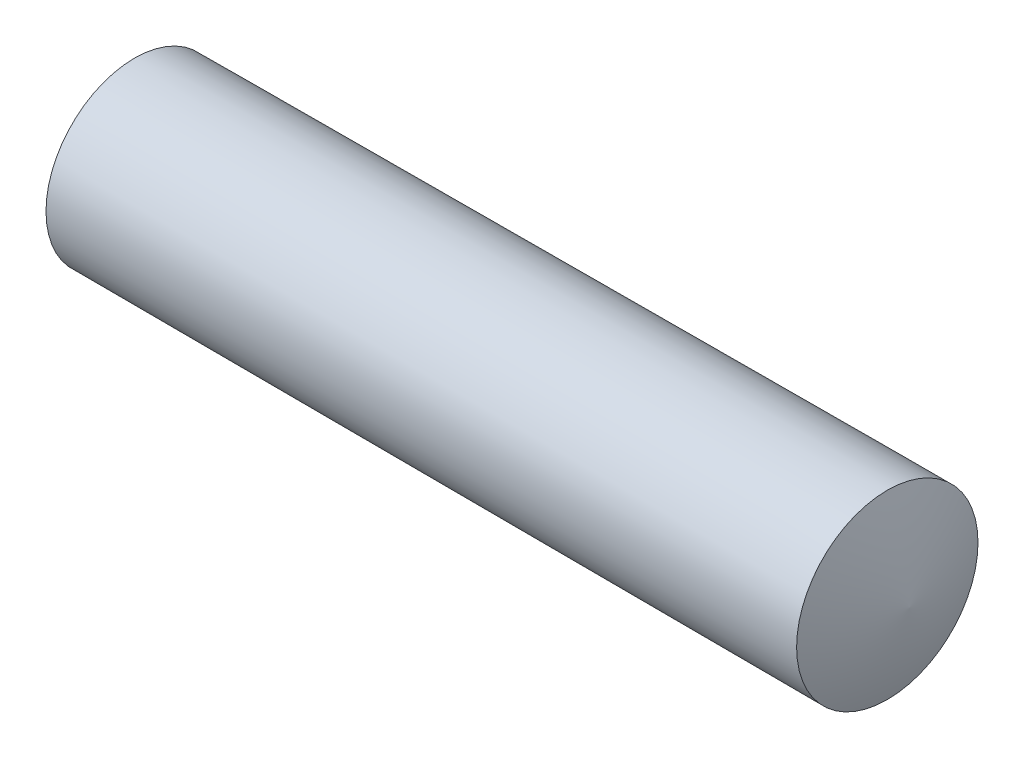
ISO-10303-21;
HEADER;
FILE_DESCRIPTION(('STEP AP214'),'2;1');
FILE_NAME('part.step','',(''),(''),'','','');
FILE_SCHEMA(('AUTOMOTIVE_DESIGN { 1 0 10303 214 1 1 1 1 }'));
ENDSEC;
DATA;
#1=APPLICATION_CONTEXT('core data for automotive mechanical design processes');
#2=APPLICATION_PROTOCOL_DEFINITION('international standard','automotive_design',2000,#1);
#3=PRODUCT_CONTEXT('',#1,'mechanical');
#4=PRODUCT('Part','Part','',(#3));
#5=PRODUCT_RELATED_PRODUCT_CATEGORY('part','',(#4));
#6=PRODUCT_DEFINITION_FORMATION('','',#4);
#7=PRODUCT_DEFINITION_CONTEXT('part definition',#1,'design');
#8=PRODUCT_DEFINITION('design','',#6,#7);
#9=PRODUCT_DEFINITION_SHAPE('','',#8);
#10=(LENGTH_UNIT() NAMED_UNIT(*) SI_UNIT(.MILLI.,.METRE.));
#11=(NAMED_UNIT(*) PLANE_ANGLE_UNIT() SI_UNIT($,.RADIAN.));
#12=(NAMED_UNIT(*) SI_UNIT($,.STERADIAN.) SOLID_ANGLE_UNIT());
#13=UNCERTAINTY_MEASURE_WITH_UNIT(LENGTH_MEASURE(1.E-05),#10,'distance_accuracy_value','');
#14=(GEOMETRIC_REPRESENTATION_CONTEXT(3) GLOBAL_UNCERTAINTY_ASSIGNED_CONTEXT((#13)) GLOBAL_UNIT_ASSIGNED_CONTEXT((#10,
#11,#12)) REPRESENTATION_CONTEXT('',''));
#15=CARTESIAN_POINT('',(0.,0.,0.));
#16=DIRECTION('',(0.,0.,1.));
#17=DIRECTION('',(1.,0.,0.));
#18=AXIS2_PLACEMENT_3D('',#15,#16,#17);
#19=CARTESIAN_POINT('',(5.12644685018009,0.924111712545023,0.));
#20=DIRECTION('',(0.,0.,-1.));
#21=DIRECTION('',(0.,-1.,0.));
#22=AXIS2_PLACEMENT_3D('',#19,#20,#21);
#23=CIRCLE('',#22,8.);
#24=TRIMMED_CURVE('',#23,(PARAMETER_VALUE(-1.45502391486666)),
(PARAMETER_VALUE(1.45502391486666)),.T.,.PARAMETER.);
#25=CARTESIAN_POINT('',(5.12644685018009,0.,0.));
#26=DIRECTION('',(-1.,0.,0.));
#27=AXIS1_PLACEMENT('',#25,#26);
#28=SURFACE_OF_REVOLUTION('',#24,#27);
#29=CARTESIAN_POINT('',(-2.32,0.,0.));
#30=DIRECTION('',(-1.,0.,0.));
#31=DIRECTION('',(0.,-1.,0.));
#32=AXIS2_PLACEMENT_3D('',#29,#30,#31);
#33=CIRCLE('',#32,2.);
#34=CARTESIAN_POINT('',(-2.32,-2.,0.));
#35=VERTEX_POINT('',#34);
#36=EDGE_CURVE('E11',#35,#35,#33,.T.);
#37=ORIENTED_EDGE('',*,*,#36,.T.);
#38=EDGE_LOOP('',(#37));
#39=FACE_BOUND('',#38,.T.);
#40=CARTESIAN_POINT('',(-2.82,0.,0.));
#41=VERTEX_POINT('',#40);
#42=VERTEX_LOOP('',#41);
#43=FACE_BOUND('',#42,.T.);
#44=ADVANCED_FACE('F41',(#39,#43),#28,.T.);
#45=CARTESIAN_POINT('',(-2.32,0.,0.));
#46=DIRECTION('',(1.,0.,0.));
#47=DIRECTION('',(0.,1.,0.));
#48=AXIS2_PLACEMENT_3D('',#45,#46,#47);
#49=CONICAL_SURFACE('',#48,2.,0.00283558375648885);
#50=CARTESIAN_POINT('',(14.68,0.,0.));
#51=DIRECTION('',(-1.,0.,0.));
#52=DIRECTION('',(0.,-1.,0.));
#53=AXIS2_PLACEMENT_3D('',#50,#51,#52);
#54=CIRCLE('',#53,2.04820505305852);
#55=CARTESIAN_POINT('',(14.68,-2.04820505305852,0.));
#56=VERTEX_POINT('',#55);
#57=EDGE_CURVE('E49',#56,#56,#54,.T.);
#58=ORIENTED_EDGE('',*,*,#57,.T.);
#59=EDGE_LOOP('',(#58));
#60=FACE_BOUND('',#59,.T.);
#61=ORIENTED_EDGE('',*,*,#36,.F.);
#62=EDGE_LOOP('',(#61));
#63=FACE_BOUND('',#62,.T.);
#64=ADVANCED_FACE('F58',(#60,#63),#49,.T.);
#65=CARTESIAN_POINT('',(6.94931550217498,0.924111712545023,0.));
#66=DIRECTION('',(0.,0.,-1.));
#67=DIRECTION('',(0.,-1.,0.));
#68=AXIS2_PLACEMENT_3D('',#65,#66,#67);
#69=CIRCLE('',#68,8.2824);
#70=TRIMMED_CURVE('',#69,(PARAMETER_VALUE(-1.45898816477184)),
(PARAMETER_VALUE(1.45898816477184)),.T.,.PARAMETER.);
#71=CARTESIAN_POINT('',(6.94931550217498,0.,0.));
#72=DIRECTION('',(-1.,0.,0.));
#73=AXIS1_PLACEMENT('',#71,#72);
#74=SURFACE_OF_REVOLUTION('',#70,#73);
#75=CARTESIAN_POINT('',(15.18,0.,0.));
#76=VERTEX_POINT('',#75);
#77=VERTEX_LOOP('',#76);
#78=FACE_BOUND('',#77,.T.);
#79=ORIENTED_EDGE('',*,*,#57,.F.);
#80=EDGE_LOOP('',(#79));
#81=FACE_BOUND('',#80,.T.);
#82=ADVANCED_FACE('F55',(#78,#81),#74,.T.);
#83=CLOSED_SHELL('',(#44,#64,#82));
#84=MANIFOLD_SOLID_BREP('B2',#83);
#85=ADVANCED_BREP_SHAPE_REPRESENTATION('',(#18,#84),#14);
#86=SHAPE_DEFINITION_REPRESENTATION(#9,#85);
ENDSEC;
END-ISO-10303-21;
